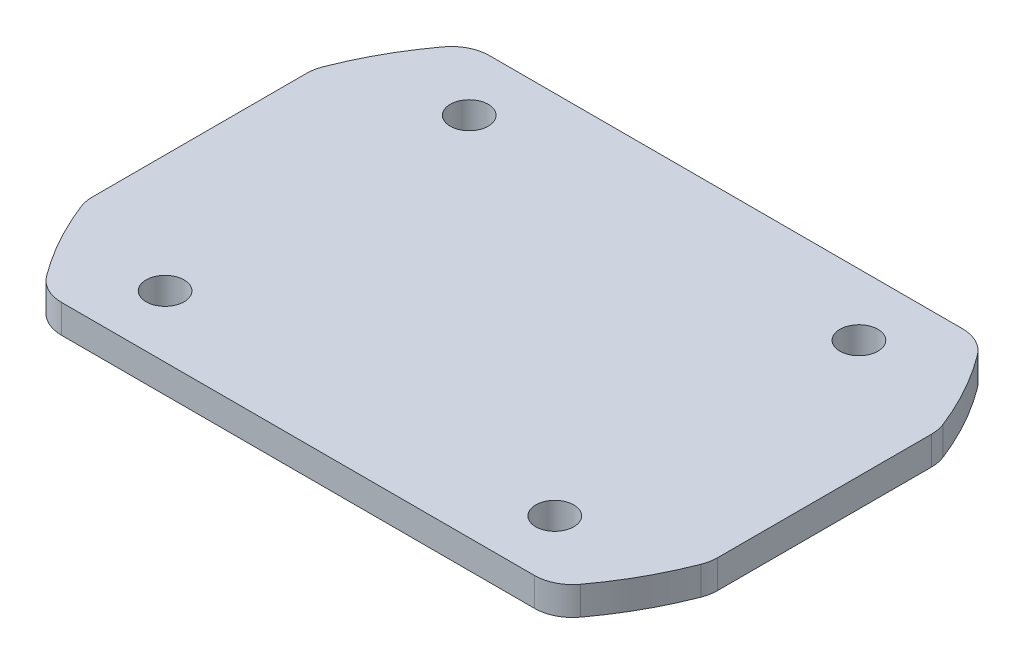
ISO-10303-21;
HEADER;
FILE_DESCRIPTION(('STEP AP214'),'2;1');
FILE_NAME('part.step','',(''),(''),'','','');
FILE_SCHEMA(('AUTOMOTIVE_DESIGN { 1 0 10303 214 1 1 1 1 }'));
ENDSEC;
DATA;
#1=APPLICATION_CONTEXT('core data for automotive mechanical design processes');
#2=APPLICATION_PROTOCOL_DEFINITION('international standard','automotive_design',2000,#1);
#3=PRODUCT_CONTEXT('',#1,'mechanical');
#4=PRODUCT('Part','Part','',(#3));
#5=PRODUCT_RELATED_PRODUCT_CATEGORY('part','',(#4));
#6=PRODUCT_DEFINITION_FORMATION('','',#4);
#7=PRODUCT_DEFINITION_CONTEXT('part definition',#1,'design');
#8=PRODUCT_DEFINITION('design','',#6,#7);
#9=PRODUCT_DEFINITION_SHAPE('','',#8);
#10=(LENGTH_UNIT() NAMED_UNIT(*) SI_UNIT(.MILLI.,.METRE.));
#11=(NAMED_UNIT(*) PLANE_ANGLE_UNIT() SI_UNIT($,.RADIAN.));
#12=(NAMED_UNIT(*) SI_UNIT($,.STERADIAN.) SOLID_ANGLE_UNIT());
#13=UNCERTAINTY_MEASURE_WITH_UNIT(LENGTH_MEASURE(1.E-05),#10,'distance_accuracy_value','');
#14=(GEOMETRIC_REPRESENTATION_CONTEXT(3) GLOBAL_UNCERTAINTY_ASSIGNED_CONTEXT((#13)) GLOBAL_UNIT_ASSIGNED_CONTEXT((#10,
#11,#12)) REPRESENTATION_CONTEXT('',''));
#15=CARTESIAN_POINT('',(0.,0.,0.));
#16=DIRECTION('',(0.,0.,1.));
#17=DIRECTION('',(1.,0.,0.));
#18=AXIS2_PLACEMENT_3D('',#15,#16,#17);
#19=CARTESIAN_POINT('',(0.,1.5,0.));
#20=DIRECTION('',(0.,1.,0.));
#21=DIRECTION('',(0.,0.,1.));
#22=AXIS2_PLACEMENT_3D('',#19,#20,#21);
#23=PLANE('',#22);
#24=CARTESIAN_POINT('',(-10.25,1.5,-8.));
#25=DIRECTION('',(0.,1.,0.));
#26=DIRECTION('',(0.,0.,1.));
#27=AXIS2_PLACEMENT_3D('',#24,#25,#26);
#28=CIRCLE('',#27,0.999999999999999);
#29=CARTESIAN_POINT('',(-10.25,1.5,-7.));
#30=VERTEX_POINT('',#29);
#31=EDGE_CURVE('E420',#30,#30,#28,.T.);
#32=ORIENTED_EDGE('',*,*,#31,.F.);
#33=EDGE_LOOP('',(#32));
#34=FACE_BOUND('',#33,.T.);
#35=CARTESIAN_POINT('',(-10.25,1.5,8.));
#36=DIRECTION('',(0.,1.,0.));
#37=DIRECTION('',(0.,0.,-1.));
#38=AXIS2_PLACEMENT_3D('',#35,#36,#37);
#39=CIRCLE('',#38,1.);
#40=CARTESIAN_POINT('',(-10.25,1.5,7.));
#41=VERTEX_POINT('',#40);
#42=EDGE_CURVE('E183',#41,#41,#39,.T.);
#43=ORIENTED_EDGE('',*,*,#42,.F.);
#44=EDGE_LOOP('',(#43));
#45=FACE_BOUND('',#44,.T.);
#46=DIRECTION('',(-1.,0.,0.));
#47=VECTOR('',#46,1.);
#48=CARTESIAN_POINT('',(-13.4047566184545,1.5,-11.25));
#49=LINE('',#48,#47);
#50=CARTESIAN_POINT('',(12.4373429638327,1.5,-11.25));
#51=VERTEX_POINT('',#50);
#52=CARTESIAN_POINT('',(-12.4373429638327,1.5,-11.25));
#53=VERTEX_POINT('',#52);
#54=EDGE_CURVE('E192',#51,#53,#49,.T.);
#55=ORIENTED_EDGE('',*,*,#54,.T.);
#56=CARTESIAN_POINT('',(-12.4373429638327,1.5,-9.25));
#57=DIRECTION('',(0.,1.,0.));
#58=DIRECTION('',(0.,0.,1.));
#59=AXIS2_PLACEMENT_3D('',#56,#57,#58);
#60=CIRCLE('',#59,2.);
#61=CARTESIAN_POINT('',(-14.0421614107789,1.5,-10.4435483870968));
#62=VERTEX_POINT('',#61);
#63=EDGE_CURVE('E239',#53,#62,#60,.T.);
#64=ORIENTED_EDGE('',*,*,#63,.T.);
#65=CARTESIAN_POINT('',(0.,1.5,0.));
#66=DIRECTION('',(0.,1.,0.));
#67=DIRECTION('',(0.,0.,1.));
#68=AXIS2_PLACEMENT_3D('',#65,#66,#67);
#69=CIRCLE('',#68,17.5);
#70=CARTESIAN_POINT('',(-16.3024154128089,1.5,-6.36248785525056));
#71=VERTEX_POINT('',#70);
#72=EDGE_CURVE('E175',#62,#71,#69,.T.);
#73=ORIENTED_EDGE('',*,*,#72,.T.);
#74=CARTESIAN_POINT('',(-14.4392822227736,1.5,-5.63534638607907));
#75=DIRECTION('',(0.,1.,0.));
#76=DIRECTION('',(0.,0.,1.));
#77=AXIS2_PLACEMENT_3D('',#74,#75,#76);
#78=CIRCLE('',#77,2.);
#79=CARTESIAN_POINT('',(-16.4392822227736,1.5,-5.63534638607907));
#80=VERTEX_POINT('',#79);
#81=EDGE_CURVE('E226',#71,#80,#78,.T.);
#82=ORIENTED_EDGE('',*,*,#81,.T.);
#83=DIRECTION('',(0.,0.,1.));
#84=VECTOR('',#83,1.);
#85=CARTESIAN_POINT('',(-16.4392822227736,1.5,-6.));
#86=LINE('',#85,#84);
#87=CARTESIAN_POINT('',(-16.4392822227736,1.5,5.63534638607907));
#88=VERTEX_POINT('',#87);
#89=EDGE_CURVE('E271',#80,#88,#86,.T.);
#90=ORIENTED_EDGE('',*,*,#89,.T.);
#91=CARTESIAN_POINT('',(-14.4392822227736,1.5,5.63534638607907));
#92=DIRECTION('',(0.,1.,0.));
#93=DIRECTION('',(0.,0.,1.));
#94=AXIS2_PLACEMENT_3D('',#91,#92,#93);
#95=CIRCLE('',#94,2.);
#96=CARTESIAN_POINT('',(-16.3024154128089,1.5,6.36248785525056));
#97=VERTEX_POINT('',#96);
#98=EDGE_CURVE('E228',#88,#97,#95,.T.);
#99=ORIENTED_EDGE('',*,*,#98,.T.);
#100=CARTESIAN_POINT('',(0.,1.5,0.));
#101=DIRECTION('',(0.,1.,0.));
#102=DIRECTION('',(0.,0.,1.));
#103=AXIS2_PLACEMENT_3D('',#100,#101,#102);
#104=CIRCLE('',#103,17.5);
#105=CARTESIAN_POINT('',(-14.0421614107789,1.5,10.4435483870968));
#106=VERTEX_POINT('',#105);
#107=EDGE_CURVE('E284',#97,#106,#104,.T.);
#108=ORIENTED_EDGE('',*,*,#107,.T.);
#109=CARTESIAN_POINT('',(-12.4373429638327,1.5,9.25));
#110=DIRECTION('',(0.,1.,0.));
#111=DIRECTION('',(0.,0.,1.));
#112=AXIS2_PLACEMENT_3D('',#109,#110,#111);
#113=CIRCLE('',#112,2.);
#114=CARTESIAN_POINT('',(-12.4373429638327,1.5,11.25));
#115=VERTEX_POINT('',#114);
#116=EDGE_CURVE('E230',#106,#115,#113,.T.);
#117=ORIENTED_EDGE('',*,*,#116,.T.);
#118=DIRECTION('',(1.,0.,0.));
#119=VECTOR('',#118,1.);
#120=CARTESIAN_POINT('',(-13.4047566184545,1.5,11.25));
#121=LINE('',#120,#119);
#122=CARTESIAN_POINT('',(12.4373429638327,1.5,11.25));
#123=VERTEX_POINT('',#122);
#124=EDGE_CURVE('E286',#115,#123,#121,.T.);
#125=ORIENTED_EDGE('',*,*,#124,.T.);
#126=CARTESIAN_POINT('',(12.4373429638327,1.5,9.25));
#127=DIRECTION('',(0.,1.,0.));
#128=DIRECTION('',(0.,0.,1.));
#129=AXIS2_PLACEMENT_3D('',#126,#127,#128);
#130=CIRCLE('',#129,2.);
#131=CARTESIAN_POINT('',(14.0421614107789,1.5,10.4435483870968));
#132=VERTEX_POINT('',#131);
#133=EDGE_CURVE('E232',#123,#132,#130,.T.);
#134=ORIENTED_EDGE('',*,*,#133,.T.);
#135=CARTESIAN_POINT('',(0.,1.5,0.));
#136=DIRECTION('',(0.,1.,0.));
#137=DIRECTION('',(0.,0.,1.));
#138=AXIS2_PLACEMENT_3D('',#135,#136,#137);
#139=CIRCLE('',#138,17.5);
#140=CARTESIAN_POINT('',(16.3024154128089,1.5,6.36248785525056));
#141=VERTEX_POINT('',#140);
#142=EDGE_CURVE('E289',#132,#141,#139,.T.);
#143=ORIENTED_EDGE('',*,*,#142,.T.);
#144=CARTESIAN_POINT('',(14.4392822227736,1.5,5.63534638607907));
#145=DIRECTION('',(0.,1.,0.));
#146=DIRECTION('',(0.,0.,1.));
#147=AXIS2_PLACEMENT_3D('',#144,#145,#146);
#148=CIRCLE('',#147,2.);
#149=CARTESIAN_POINT('',(16.4392822227736,1.5,5.63534638607907));
#150=VERTEX_POINT('',#149);
#151=EDGE_CURVE('E234',#141,#150,#148,.T.);
#152=ORIENTED_EDGE('',*,*,#151,.T.);
#153=DIRECTION('',(0.,0.,-1.));
#154=VECTOR('',#153,1.);
#155=CARTESIAN_POINT('',(16.4392822227736,1.5,-6.));
#156=LINE('',#155,#154);
#157=CARTESIAN_POINT('',(16.4392822227736,1.5,-5.63534638607907));
#158=VERTEX_POINT('',#157);
#159=EDGE_CURVE('E296',#150,#158,#156,.T.);
#160=ORIENTED_EDGE('',*,*,#159,.T.);
#161=CARTESIAN_POINT('',(14.4392822227736,1.5,-5.63534638607907));
#162=DIRECTION('',(0.,1.,0.));
#163=DIRECTION('',(0.,0.,1.));
#164=AXIS2_PLACEMENT_3D('',#161,#162,#163);
#165=CIRCLE('',#164,2.);
#166=CARTESIAN_POINT('',(16.3024154128089,1.5,-6.36248785525056));
#167=VERTEX_POINT('',#166);
#168=EDGE_CURVE('E63',#158,#167,#165,.T.);
#169=ORIENTED_EDGE('',*,*,#168,.T.);
#170=CARTESIAN_POINT('',(0.,1.5,0.));
#171=DIRECTION('',(0.,1.,0.));
#172=DIRECTION('',(0.,0.,1.));
#173=AXIS2_PLACEMENT_3D('',#170,#171,#172);
#174=CIRCLE('',#173,17.5);
#175=CARTESIAN_POINT('',(14.0421614107789,1.5,-10.4435483870968));
#176=VERTEX_POINT('',#175);
#177=EDGE_CURVE('E297',#167,#176,#174,.T.);
#178=ORIENTED_EDGE('',*,*,#177,.T.);
#179=CARTESIAN_POINT('',(12.4373429638327,1.5,-9.25));
#180=DIRECTION('',(0.,1.,0.));
#181=DIRECTION('',(0.,0.,1.));
#182=AXIS2_PLACEMENT_3D('',#179,#180,#181);
#183=CIRCLE('',#182,2.);
#184=EDGE_CURVE('E237',#176,#51,#183,.T.);
#185=ORIENTED_EDGE('',*,*,#184,.T.);
#186=EDGE_LOOP('',(#55,#64,#73,#82,#90,#99,#108,#117,#125,#134,#143,#152,#160,#169,#178,#185));
#187=FACE_BOUND('',#186,.T.);
#188=CARTESIAN_POINT('',(10.25,1.5,8.));
#189=DIRECTION('',(0.,1.,0.));
#190=DIRECTION('',(0.,0.,1.));
#191=AXIS2_PLACEMENT_3D('',#188,#189,#190);
#192=CIRCLE('',#191,1.);
#193=CARTESIAN_POINT('',(10.25,1.5,9.));
#194=VERTEX_POINT('',#193);
#195=EDGE_CURVE('E415',#194,#194,#192,.T.);
#196=ORIENTED_EDGE('',*,*,#195,.F.);
#197=EDGE_LOOP('',(#196));
#198=FACE_BOUND('',#197,.T.);
#199=CARTESIAN_POINT('',(10.25,1.5,-8.));
#200=DIRECTION('',(0.,1.,0.));
#201=DIRECTION('',(0.,0.,-1.));
#202=AXIS2_PLACEMENT_3D('',#199,#200,#201);
#203=CIRCLE('',#202,0.999999999999999);
#204=CARTESIAN_POINT('',(10.25,1.5,-9.));
#205=VERTEX_POINT('',#204);
#206=EDGE_CURVE('E426',#205,#205,#203,.T.);
#207=ORIENTED_EDGE('',*,*,#206,.F.);
#208=EDGE_LOOP('',(#207));
#209=FACE_BOUND('',#208,.T.);
#210=ADVANCED_FACE('F41',(#34,#45,#187,#198,#209),#23,.T.);
#211=CARTESIAN_POINT('',(0.,0.,0.));
#212=DIRECTION('',(0.,1.,0.));
#213=DIRECTION('',(0.,0.,1.));
#214=AXIS2_PLACEMENT_3D('',#211,#212,#213);
#215=PLANE('',#214);
#216=CARTESIAN_POINT('',(0.,0.,0.));
#217=DIRECTION('',(0.,1.,0.));
#218=DIRECTION('',(0.,0.,1.));
#219=AXIS2_PLACEMENT_3D('',#216,#217,#218);
#220=CIRCLE('',#219,17.5);
#221=CARTESIAN_POINT('',(-14.0421614107789,0.,-10.4435483870968));
#222=VERTEX_POINT('',#221);
#223=CARTESIAN_POINT('',(-16.3024154128089,0.,-6.36248785525056));
#224=VERTEX_POINT('',#223);
#225=EDGE_CURVE('E172',#222,#224,#220,.T.);
#226=ORIENTED_EDGE('',*,*,#225,.F.);
#227=CARTESIAN_POINT('',(-12.4373429638327,0.,-9.25));
#228=DIRECTION('',(0.,1.,0.));
#229=DIRECTION('',(0.,0.,1.));
#230=AXIS2_PLACEMENT_3D('',#227,#228,#229);
#231=CIRCLE('',#230,2.);
#232=CARTESIAN_POINT('',(-12.4373429638327,0.,-11.25));
#233=VERTEX_POINT('',#232);
#234=EDGE_CURVE('E155',#222,#233,#231,.F.);
#235=ORIENTED_EDGE('',*,*,#234,.T.);
#236=DIRECTION('',(-1.,0.,0.));
#237=VECTOR('',#236,1.);
#238=CARTESIAN_POINT('',(-13.4047566184545,0.,-11.25));
#239=LINE('',#238,#237);
#240=CARTESIAN_POINT('',(12.4373429638327,0.,-11.25));
#241=VERTEX_POINT('',#240);
#242=EDGE_CURVE('E208',#241,#233,#239,.T.);
#243=ORIENTED_EDGE('',*,*,#242,.F.);
#244=CARTESIAN_POINT('',(12.4373429638327,0.,-9.25));
#245=DIRECTION('',(0.,1.,0.));
#246=DIRECTION('',(0.,0.,1.));
#247=AXIS2_PLACEMENT_3D('',#244,#245,#246);
#248=CIRCLE('',#247,2.);
#249=CARTESIAN_POINT('',(14.0421614107789,0.,-10.4435483870968));
#250=VERTEX_POINT('',#249);
#251=EDGE_CURVE('E166',#241,#250,#248,.F.);
#252=ORIENTED_EDGE('',*,*,#251,.T.);
#253=CARTESIAN_POINT('',(0.,0.,0.));
#254=DIRECTION('',(0.,1.,0.));
#255=DIRECTION('',(0.,0.,1.));
#256=AXIS2_PLACEMENT_3D('',#253,#254,#255);
#257=CIRCLE('',#256,17.5);
#258=CARTESIAN_POINT('',(16.3024154128089,0.,-6.36248785525056));
#259=VERTEX_POINT('',#258);
#260=EDGE_CURVE('E206',#259,#250,#257,.T.);
#261=ORIENTED_EDGE('',*,*,#260,.F.);
#262=CARTESIAN_POINT('',(14.4392822227736,0.,-5.63534638607907));
#263=DIRECTION('',(0.,1.,0.));
#264=DIRECTION('',(0.,0.,1.));
#265=AXIS2_PLACEMENT_3D('',#262,#263,#264);
#266=CIRCLE('',#265,2.);
#267=CARTESIAN_POINT('',(16.4392822227736,0.,-5.63534638607907));
#268=VERTEX_POINT('',#267);
#269=EDGE_CURVE('E220',#259,#268,#266,.F.);
#270=ORIENTED_EDGE('',*,*,#269,.T.);
#271=DIRECTION('',(0.,0.,-1.));
#272=VECTOR('',#271,1.);
#273=CARTESIAN_POINT('',(16.4392822227736,0.,-6.));
#274=LINE('',#273,#272);
#275=CARTESIAN_POINT('',(16.4392822227736,0.,5.63534638607907));
#276=VERTEX_POINT('',#275);
#277=EDGE_CURVE('E203',#276,#268,#274,.T.);
#278=ORIENTED_EDGE('',*,*,#277,.F.);
#279=CARTESIAN_POINT('',(14.4392822227736,0.,5.63534638607907));
#280=DIRECTION('',(0.,1.,0.));
#281=DIRECTION('',(0.,0.,1.));
#282=AXIS2_PLACEMENT_3D('',#279,#280,#281);
#283=CIRCLE('',#282,2.);
#284=CARTESIAN_POINT('',(16.3024154128089,0.,6.36248785525056));
#285=VERTEX_POINT('',#284);
#286=EDGE_CURVE('E218',#276,#285,#283,.F.);
#287=ORIENTED_EDGE('',*,*,#286,.T.);
#288=CARTESIAN_POINT('',(0.,0.,0.));
#289=DIRECTION('',(0.,1.,0.));
#290=DIRECTION('',(0.,0.,1.));
#291=AXIS2_PLACEMENT_3D('',#288,#289,#290);
#292=CIRCLE('',#291,17.5);
#293=CARTESIAN_POINT('',(14.0421614107789,0.,10.4435483870968));
#294=VERTEX_POINT('',#293);
#295=EDGE_CURVE('E200',#294,#285,#292,.T.);
#296=ORIENTED_EDGE('',*,*,#295,.F.);
#297=CARTESIAN_POINT('',(12.4373429638327,0.,9.25));
#298=DIRECTION('',(0.,1.,0.));
#299=DIRECTION('',(0.,0.,1.));
#300=AXIS2_PLACEMENT_3D('',#297,#298,#299);
#301=CIRCLE('',#300,2.);
#302=CARTESIAN_POINT('',(12.4373429638327,0.,11.25));
#303=VERTEX_POINT('',#302);
#304=EDGE_CURVE('E216',#294,#303,#301,.F.);
#305=ORIENTED_EDGE('',*,*,#304,.T.);
#306=DIRECTION('',(1.,0.,0.));
#307=VECTOR('',#306,1.);
#308=CARTESIAN_POINT('',(-13.4047566184545,0.,11.25));
#309=LINE('',#308,#307);
#310=CARTESIAN_POINT('',(-12.4373429638327,0.,11.25));
#311=VERTEX_POINT('',#310);
#312=EDGE_CURVE('E197',#311,#303,#309,.T.);
#313=ORIENTED_EDGE('',*,*,#312,.F.);
#314=CARTESIAN_POINT('',(-12.4373429638327,0.,9.25));
#315=DIRECTION('',(0.,1.,0.));
#316=DIRECTION('',(0.,0.,1.));
#317=AXIS2_PLACEMENT_3D('',#314,#315,#316);
#318=CIRCLE('',#317,2.);
#319=CARTESIAN_POINT('',(-14.0421614107789,0.,10.4435483870968));
#320=VERTEX_POINT('',#319);
#321=EDGE_CURVE('E214',#311,#320,#318,.F.);
#322=ORIENTED_EDGE('',*,*,#321,.T.);
#323=CARTESIAN_POINT('',(0.,0.,0.));
#324=DIRECTION('',(0.,1.,0.));
#325=DIRECTION('',(0.,0.,1.));
#326=AXIS2_PLACEMENT_3D('',#323,#324,#325);
#327=CIRCLE('',#326,17.5);
#328=CARTESIAN_POINT('',(-16.3024154128089,0.,6.36248785525056));
#329=VERTEX_POINT('',#328);
#330=EDGE_CURVE('E186',#329,#320,#327,.T.);
#331=ORIENTED_EDGE('',*,*,#330,.F.);
#332=CARTESIAN_POINT('',(-14.4392822227736,0.,5.63534638607907));
#333=DIRECTION('',(0.,1.,0.));
#334=DIRECTION('',(0.,0.,1.));
#335=AXIS2_PLACEMENT_3D('',#332,#333,#334);
#336=CIRCLE('',#335,2.);
#337=CARTESIAN_POINT('',(-16.4392822227736,0.,5.63534638607907));
#338=VERTEX_POINT('',#337);
#339=EDGE_CURVE('E212',#329,#338,#336,.F.);
#340=ORIENTED_EDGE('',*,*,#339,.T.);
#341=DIRECTION('',(0.,0.,1.));
#342=VECTOR('',#341,1.);
#343=CARTESIAN_POINT('',(-16.4392822227736,0.,-6.));
#344=LINE('',#343,#342);
#345=CARTESIAN_POINT('',(-16.4392822227736,0.,-5.63534638607907));
#346=VERTEX_POINT('',#345);
#347=EDGE_CURVE('E182',#346,#338,#344,.T.);
#348=ORIENTED_EDGE('',*,*,#347,.F.);
#349=CARTESIAN_POINT('',(-14.4392822227736,0.,-5.63534638607907));
#350=DIRECTION('',(0.,1.,0.));
#351=DIRECTION('',(0.,0.,1.));
#352=AXIS2_PLACEMENT_3D('',#349,#350,#351);
#353=CIRCLE('',#352,2.);
#354=EDGE_CURVE('E176',#346,#224,#353,.F.);
#355=ORIENTED_EDGE('',*,*,#354,.T.);
#356=EDGE_LOOP('',(#226,#235,#243,#252,#261,#270,#278,#287,#296,#305,#313,#322,#331,#340,#348,#355));
#357=FACE_BOUND('',#356,.T.);
#358=CARTESIAN_POINT('',(-10.25,0.,8.));
#359=DIRECTION('',(0.,1.,0.));
#360=DIRECTION('',(0.,0.,-1.));
#361=AXIS2_PLACEMENT_3D('',#358,#359,#360);
#362=CIRCLE('',#361,1.);
#363=CARTESIAN_POINT('',(-10.25,0.,7.));
#364=VERTEX_POINT('',#363);
#365=EDGE_CURVE('E189',#364,#364,#362,.T.);
#366=ORIENTED_EDGE('',*,*,#365,.T.);
#367=EDGE_LOOP('',(#366));
#368=FACE_BOUND('',#367,.T.);
#369=CARTESIAN_POINT('',(10.25,0.,8.));
#370=DIRECTION('',(0.,1.,0.));
#371=DIRECTION('',(0.,0.,1.));
#372=AXIS2_PLACEMENT_3D('',#369,#370,#371);
#373=CIRCLE('',#372,1.);
#374=CARTESIAN_POINT('',(10.25,0.,9.));
#375=VERTEX_POINT('',#374);
#376=EDGE_CURVE('E417',#375,#375,#373,.T.);
#377=ORIENTED_EDGE('',*,*,#376,.T.);
#378=EDGE_LOOP('',(#377));
#379=FACE_BOUND('',#378,.T.);
#380=CARTESIAN_POINT('',(-10.25,0.,-8.));
#381=DIRECTION('',(0.,1.,0.));
#382=DIRECTION('',(0.,0.,1.));
#383=AXIS2_PLACEMENT_3D('',#380,#381,#382);
#384=CIRCLE('',#383,0.999999999999999);
#385=CARTESIAN_POINT('',(-10.25,0.,-7.));
#386=VERTEX_POINT('',#385);
#387=EDGE_CURVE('E423',#386,#386,#384,.T.);
#388=ORIENTED_EDGE('',*,*,#387,.T.);
#389=EDGE_LOOP('',(#388));
#390=FACE_BOUND('',#389,.T.);
#391=CARTESIAN_POINT('',(10.25,0.,-8.));
#392=DIRECTION('',(0.,1.,0.));
#393=DIRECTION('',(0.,0.,-1.));
#394=AXIS2_PLACEMENT_3D('',#391,#392,#393);
#395=CIRCLE('',#394,0.999999999999999);
#396=CARTESIAN_POINT('',(10.25,0.,-9.));
#397=VERTEX_POINT('',#396);
#398=EDGE_CURVE('E429',#397,#397,#395,.T.);
#399=ORIENTED_EDGE('',*,*,#398,.T.);
#400=EDGE_LOOP('',(#399));
#401=FACE_BOUND('',#400,.T.);
#402=ADVANCED_FACE('F179',(#357,#368,#379,#390,#401),#215,.F.);
#403=CARTESIAN_POINT('',(0.,1.5,0.));
#404=DIRECTION('',(0.,-1.,0.));
#405=DIRECTION('',(0.,0.,-1.));
#406=AXIS2_PLACEMENT_3D('',#403,#404,#405);
#407=CYLINDRICAL_SURFACE('',#406,17.5);
#408=ORIENTED_EDGE('',*,*,#72,.F.);
#409=DIRECTION('',(0.,-1.,0.));
#410=VECTOR('',#409,1.);
#411=CARTESIAN_POINT('',(-14.0421614107789,1.5,-10.4435483870968));
#412=LINE('',#411,#410);
#413=EDGE_CURVE('E159',#62,#222,#412,.T.);
#414=ORIENTED_EDGE('',*,*,#413,.T.);
#415=ORIENTED_EDGE('',*,*,#225,.T.);
#416=DIRECTION('',(0.,-1.,0.));
#417=VECTOR('',#416,1.);
#418=CARTESIAN_POINT('',(-16.3024154128089,1.5,-6.36248785525056));
#419=LINE('',#418,#417);
#420=EDGE_CURVE('E177',#224,#71,#419,.F.);
#421=ORIENTED_EDGE('',*,*,#420,.T.);
#422=EDGE_LOOP('',(#408,#414,#415,#421));
#423=FACE_BOUND('',#422,.T.);
#424=ADVANCED_FACE('F171',(#423),#407,.T.);
#425=CARTESIAN_POINT('',(-16.4392822227736,1.5,-6.));
#426=DIRECTION('',(1.,0.,0.));
#427=DIRECTION('',(0.,0.,-1.));
#428=AXIS2_PLACEMENT_3D('',#425,#426,#427);
#429=PLANE('',#428);
#430=ORIENTED_EDGE('',*,*,#347,.T.);
#431=DIRECTION('',(0.,-1.,0.));
#432=VECTOR('',#431,1.);
#433=CARTESIAN_POINT('',(-16.4392822227736,1.5,5.63534638607907));
#434=LINE('',#433,#432);
#435=EDGE_CURVE('E11',#338,#88,#434,.F.);
#436=ORIENTED_EDGE('',*,*,#435,.T.);
#437=ORIENTED_EDGE('',*,*,#89,.F.);
#438=DIRECTION('',(0.,-1.,0.));
#439=VECTOR('',#438,1.);
#440=CARTESIAN_POINT('',(-16.4392822227736,1.5,-5.63534638607907));
#441=LINE('',#440,#439);
#442=EDGE_CURVE('E49',#80,#346,#441,.T.);
#443=ORIENTED_EDGE('',*,*,#442,.T.);
#444=EDGE_LOOP('',(#430,#436,#437,#443));
#445=FACE_BOUND('',#444,.T.);
#446=ADVANCED_FACE('F268',(#445),#429,.F.);
#447=CARTESIAN_POINT('',(0.,1.5,0.));
#448=DIRECTION('',(0.,-1.,0.));
#449=DIRECTION('',(0.,0.,-1.));
#450=AXIS2_PLACEMENT_3D('',#447,#448,#449);
#451=CYLINDRICAL_SURFACE('',#450,17.5);
#452=ORIENTED_EDGE('',*,*,#330,.T.);
#453=DIRECTION('',(0.,-1.,0.));
#454=VECTOR('',#453,1.);
#455=CARTESIAN_POINT('',(-14.0421614107789,1.5,10.4435483870968));
#456=LINE('',#455,#454);
#457=EDGE_CURVE('E263',#320,#106,#456,.F.);
#458=ORIENTED_EDGE('',*,*,#457,.T.);
#459=ORIENTED_EDGE('',*,*,#107,.F.);
#460=DIRECTION('',(0.,-1.,0.));
#461=VECTOR('',#460,1.);
#462=CARTESIAN_POINT('',(-16.3024154128089,1.5,6.36248785525056));
#463=LINE('',#462,#461);
#464=EDGE_CURVE('E260',#97,#329,#463,.T.);
#465=ORIENTED_EDGE('',*,*,#464,.T.);
#466=EDGE_LOOP('',(#452,#458,#459,#465));
#467=FACE_BOUND('',#466,.T.);
#468=ADVANCED_FACE('F281',(#467),#451,.T.);
#469=CARTESIAN_POINT('',(-13.4047566184545,1.5,11.25));
#470=DIRECTION('',(0.,0.,-1.));
#471=DIRECTION('',(-1.,0.,0.));
#472=AXIS2_PLACEMENT_3D('',#469,#470,#471);
#473=PLANE('',#472);
#474=ORIENTED_EDGE('',*,*,#312,.T.);
#475=DIRECTION('',(0.,-1.,0.));
#476=VECTOR('',#475,1.);
#477=CARTESIAN_POINT('',(12.4373429638327,1.5,11.25));
#478=LINE('',#477,#476);
#479=EDGE_CURVE('E258',#303,#123,#478,.F.);
#480=ORIENTED_EDGE('',*,*,#479,.T.);
#481=ORIENTED_EDGE('',*,*,#124,.F.);
#482=DIRECTION('',(0.,-1.,0.));
#483=VECTOR('',#482,1.);
#484=CARTESIAN_POINT('',(-12.4373429638327,1.5,11.25));
#485=LINE('',#484,#483);
#486=EDGE_CURVE('E255',#115,#311,#485,.T.);
#487=ORIENTED_EDGE('',*,*,#486,.T.);
#488=EDGE_LOOP('',(#474,#480,#481,#487));
#489=FACE_BOUND('',#488,.T.);
#490=ADVANCED_FACE('F333',(#489),#473,.F.);
#491=CARTESIAN_POINT('',(0.,1.5,0.));
#492=DIRECTION('',(0.,-1.,0.));
#493=DIRECTION('',(0.,0.,-1.));
#494=AXIS2_PLACEMENT_3D('',#491,#492,#493);
#495=CYLINDRICAL_SURFACE('',#494,17.5);
#496=ORIENTED_EDGE('',*,*,#295,.T.);
#497=DIRECTION('',(0.,-1.,0.));
#498=VECTOR('',#497,1.);
#499=CARTESIAN_POINT('',(16.3024154128089,1.5,6.36248785525056));
#500=LINE('',#499,#498);
#501=EDGE_CURVE('E253',#285,#141,#500,.F.);
#502=ORIENTED_EDGE('',*,*,#501,.T.);
#503=ORIENTED_EDGE('',*,*,#142,.F.);
#504=DIRECTION('',(0.,-1.,0.));
#505=VECTOR('',#504,1.);
#506=CARTESIAN_POINT('',(14.0421614107789,1.5,10.4435483870968));
#507=LINE('',#506,#505);
#508=EDGE_CURVE('E250',#132,#294,#507,.T.);
#509=ORIENTED_EDGE('',*,*,#508,.T.);
#510=EDGE_LOOP('',(#496,#502,#503,#509));
#511=FACE_BOUND('',#510,.T.);
#512=ADVANCED_FACE('F324',(#511),#495,.T.);
#513=CARTESIAN_POINT('',(16.4392822227736,1.5,-6.));
#514=DIRECTION('',(-1.,0.,0.));
#515=DIRECTION('',(0.,0.,1.));
#516=AXIS2_PLACEMENT_3D('',#513,#514,#515);
#517=PLANE('',#516);
#518=ORIENTED_EDGE('',*,*,#277,.T.);
#519=DIRECTION('',(0.,-1.,0.));
#520=VECTOR('',#519,1.);
#521=CARTESIAN_POINT('',(16.4392822227736,1.5,-5.63534638607907));
#522=LINE('',#521,#520);
#523=EDGE_CURVE('E248',#268,#158,#522,.F.);
#524=ORIENTED_EDGE('',*,*,#523,.T.);
#525=ORIENTED_EDGE('',*,*,#159,.F.);
#526=DIRECTION('',(0.,-1.,0.));
#527=VECTOR('',#526,1.);
#528=CARTESIAN_POINT('',(16.4392822227736,1.5,5.63534638607907));
#529=LINE('',#528,#527);
#530=EDGE_CURVE('E245',#150,#276,#529,.T.);
#531=ORIENTED_EDGE('',*,*,#530,.T.);
#532=EDGE_LOOP('',(#518,#524,#525,#531));
#533=FACE_BOUND('',#532,.T.);
#534=ADVANCED_FACE('F315',(#533),#517,.F.);
#535=CARTESIAN_POINT('',(0.,1.5,0.));
#536=DIRECTION('',(0.,-1.,0.));
#537=DIRECTION('',(0.,0.,-1.));
#538=AXIS2_PLACEMENT_3D('',#535,#536,#537);
#539=CYLINDRICAL_SURFACE('',#538,17.5);
#540=ORIENTED_EDGE('',*,*,#260,.T.);
#541=DIRECTION('',(0.,-1.,0.));
#542=VECTOR('',#541,1.);
#543=CARTESIAN_POINT('',(14.0421614107789,1.5,-10.4435483870968));
#544=LINE('',#543,#542);
#545=EDGE_CURVE('E56',#250,#176,#544,.F.);
#546=ORIENTED_EDGE('',*,*,#545,.T.);
#547=ORIENTED_EDGE('',*,*,#177,.F.);
#548=DIRECTION('',(0.,-1.,0.));
#549=VECTOR('',#548,1.);
#550=CARTESIAN_POINT('',(16.3024154128089,1.5,-6.36248785525056));
#551=LINE('',#550,#549);
#552=EDGE_CURVE('E241',#167,#259,#551,.T.);
#553=ORIENTED_EDGE('',*,*,#552,.T.);
#554=EDGE_LOOP('',(#540,#546,#547,#553));
#555=FACE_BOUND('',#554,.T.);
#556=ADVANCED_FACE('F308',(#555),#539,.T.);
#557=CARTESIAN_POINT('',(-13.4047566184545,1.5,-11.25));
#558=DIRECTION('',(0.,0.,1.));
#559=DIRECTION('',(1.,0.,0.));
#560=AXIS2_PLACEMENT_3D('',#557,#558,#559);
#561=PLANE('',#560);
#562=ORIENTED_EDGE('',*,*,#242,.T.);
#563=DIRECTION('',(0.,-1.,0.));
#564=VECTOR('',#563,1.);
#565=CARTESIAN_POINT('',(-12.4373429638327,1.5,-11.25));
#566=LINE('',#565,#564);
#567=EDGE_CURVE('E160',#233,#53,#566,.F.);
#568=ORIENTED_EDGE('',*,*,#567,.T.);
#569=ORIENTED_EDGE('',*,*,#54,.F.);
#570=DIRECTION('',(0.,-1.,0.));
#571=VECTOR('',#570,1.);
#572=CARTESIAN_POINT('',(12.4373429638327,1.5,-11.25));
#573=LINE('',#572,#571);
#574=EDGE_CURVE('E165',#51,#241,#573,.T.);
#575=ORIENTED_EDGE('',*,*,#574,.T.);
#576=EDGE_LOOP('',(#562,#568,#569,#575));
#577=FACE_BOUND('',#576,.T.);
#578=ADVANCED_FACE('F304',(#577),#561,.F.);
#579=CARTESIAN_POINT('',(-10.25,1.5,8.));
#580=DIRECTION('',(0.,-1.,0.));
#581=DIRECTION('',(0.,0.,-1.));
#582=AXIS2_PLACEMENT_3D('',#579,#580,#581);
#583=CYLINDRICAL_SURFACE('',#582,1.);
#584=ORIENTED_EDGE('',*,*,#42,.T.);
#585=EDGE_LOOP('',(#584));
#586=FACE_BOUND('',#585,.T.);
#587=ORIENTED_EDGE('',*,*,#365,.F.);
#588=EDGE_LOOP('',(#587));
#589=FACE_BOUND('',#588,.T.);
#590=ADVANCED_FACE('F356',(#586,#589),#583,.F.);
#591=CARTESIAN_POINT('',(10.25,1.5,8.));
#592=DIRECTION('',(0.,-1.,0.));
#593=DIRECTION('',(0.,0.,-1.));
#594=AXIS2_PLACEMENT_3D('',#591,#592,#593);
#595=CYLINDRICAL_SURFACE('',#594,1.);
#596=ORIENTED_EDGE('',*,*,#195,.T.);
#597=EDGE_LOOP('',(#596));
#598=FACE_BOUND('',#597,.T.);
#599=ORIENTED_EDGE('',*,*,#376,.F.);
#600=EDGE_LOOP('',(#599));
#601=FACE_BOUND('',#600,.T.);
#602=ADVANCED_FACE('F444',(#598,#601),#595,.F.);
#603=CARTESIAN_POINT('',(-10.25,1.5,-8.));
#604=DIRECTION('',(0.,-1.,0.));
#605=DIRECTION('',(0.,0.,-1.));
#606=AXIS2_PLACEMENT_3D('',#603,#604,#605);
#607=CYLINDRICAL_SURFACE('',#606,0.999999999999999);
#608=ORIENTED_EDGE('',*,*,#31,.T.);
#609=EDGE_LOOP('',(#608));
#610=FACE_BOUND('',#609,.T.);
#611=ORIENTED_EDGE('',*,*,#387,.F.);
#612=EDGE_LOOP('',(#611));
#613=FACE_BOUND('',#612,.T.);
#614=ADVANCED_FACE('F437',(#610,#613),#607,.F.);
#615=CARTESIAN_POINT('',(10.25,1.5,-8.));
#616=DIRECTION('',(0.,-1.,0.));
#617=DIRECTION('',(0.,0.,-1.));
#618=AXIS2_PLACEMENT_3D('',#615,#616,#617);
#619=CYLINDRICAL_SURFACE('',#618,0.999999999999999);
#620=ORIENTED_EDGE('',*,*,#206,.T.);
#621=EDGE_LOOP('',(#620));
#622=FACE_BOUND('',#621,.T.);
#623=ORIENTED_EDGE('',*,*,#398,.F.);
#624=EDGE_LOOP('',(#623));
#625=FACE_BOUND('',#624,.T.);
#626=ADVANCED_FACE('F377',(#622,#625),#619,.F.);
#627=CARTESIAN_POINT('',(-12.4373429638327,1.5,-9.25));
#628=DIRECTION('',(0.,-1.,0.));
#629=DIRECTION('',(0.,0.,-1.));
#630=AXIS2_PLACEMENT_3D('',#627,#628,#629);
#631=CYLINDRICAL_SURFACE('',#630,2.);
#632=ORIENTED_EDGE('',*,*,#63,.F.);
#633=ORIENTED_EDGE('',*,*,#567,.F.);
#634=ORIENTED_EDGE('',*,*,#234,.F.);
#635=ORIENTED_EDGE('',*,*,#413,.F.);
#636=EDGE_LOOP('',(#632,#633,#634,#635));
#637=FACE_BOUND('',#636,.T.);
#638=ADVANCED_FACE('F158',(#637),#631,.T.);
#639=CARTESIAN_POINT('',(12.4373429638327,1.5,-9.25));
#640=DIRECTION('',(0.,-1.,0.));
#641=DIRECTION('',(0.,0.,-1.));
#642=AXIS2_PLACEMENT_3D('',#639,#640,#641);
#643=CYLINDRICAL_SURFACE('',#642,2.);
#644=ORIENTED_EDGE('',*,*,#184,.F.);
#645=ORIENTED_EDGE('',*,*,#545,.F.);
#646=ORIENTED_EDGE('',*,*,#251,.F.);
#647=ORIENTED_EDGE('',*,*,#574,.F.);
#648=EDGE_LOOP('',(#644,#645,#646,#647));
#649=FACE_BOUND('',#648,.T.);
#650=ADVANCED_FACE('F306',(#649),#643,.T.);
#651=CARTESIAN_POINT('',(14.4392822227736,1.5,-5.63534638607907));
#652=DIRECTION('',(0.,-1.,0.));
#653=DIRECTION('',(0.,0.,-1.));
#654=AXIS2_PLACEMENT_3D('',#651,#652,#653);
#655=CYLINDRICAL_SURFACE('',#654,2.);
#656=ORIENTED_EDGE('',*,*,#168,.F.);
#657=ORIENTED_EDGE('',*,*,#523,.F.);
#658=ORIENTED_EDGE('',*,*,#269,.F.);
#659=ORIENTED_EDGE('',*,*,#552,.F.);
#660=EDGE_LOOP('',(#656,#657,#658,#659));
#661=FACE_BOUND('',#660,.T.);
#662=ADVANCED_FACE('F311',(#661),#655,.T.);
#663=CARTESIAN_POINT('',(14.4392822227736,1.5,5.63534638607907));
#664=DIRECTION('',(0.,-1.,0.));
#665=DIRECTION('',(0.,0.,-1.));
#666=AXIS2_PLACEMENT_3D('',#663,#664,#665);
#667=CYLINDRICAL_SURFACE('',#666,2.);
#668=ORIENTED_EDGE('',*,*,#151,.F.);
#669=ORIENTED_EDGE('',*,*,#501,.F.);
#670=ORIENTED_EDGE('',*,*,#286,.F.);
#671=ORIENTED_EDGE('',*,*,#530,.F.);
#672=EDGE_LOOP('',(#668,#669,#670,#671));
#673=FACE_BOUND('',#672,.T.);
#674=ADVANCED_FACE('F320',(#673),#667,.T.);
#675=CARTESIAN_POINT('',(12.4373429638327,1.5,9.25));
#676=DIRECTION('',(0.,-1.,0.));
#677=DIRECTION('',(0.,0.,-1.));
#678=AXIS2_PLACEMENT_3D('',#675,#676,#677);
#679=CYLINDRICAL_SURFACE('',#678,2.);
#680=ORIENTED_EDGE('',*,*,#133,.F.);
#681=ORIENTED_EDGE('',*,*,#479,.F.);
#682=ORIENTED_EDGE('',*,*,#304,.F.);
#683=ORIENTED_EDGE('',*,*,#508,.F.);
#684=EDGE_LOOP('',(#680,#681,#682,#683));
#685=FACE_BOUND('',#684,.T.);
#686=ADVANCED_FACE('F329',(#685),#679,.T.);
#687=CARTESIAN_POINT('',(-12.4373429638327,1.5,9.25));
#688=DIRECTION('',(0.,-1.,0.));
#689=DIRECTION('',(0.,0.,-1.));
#690=AXIS2_PLACEMENT_3D('',#687,#688,#689);
#691=CYLINDRICAL_SURFACE('',#690,2.);
#692=ORIENTED_EDGE('',*,*,#116,.F.);
#693=ORIENTED_EDGE('',*,*,#457,.F.);
#694=ORIENTED_EDGE('',*,*,#321,.F.);
#695=ORIENTED_EDGE('',*,*,#486,.F.);
#696=EDGE_LOOP('',(#692,#693,#694,#695));
#697=FACE_BOUND('',#696,.T.);
#698=ADVANCED_FACE('F337',(#697),#691,.T.);
#699=CARTESIAN_POINT('',(-14.4392822227736,1.5,5.63534638607907));
#700=DIRECTION('',(0.,-1.,0.));
#701=DIRECTION('',(0.,0.,-1.));
#702=AXIS2_PLACEMENT_3D('',#699,#700,#701);
#703=CYLINDRICAL_SURFACE('',#702,2.);
#704=ORIENTED_EDGE('',*,*,#98,.F.);
#705=ORIENTED_EDGE('',*,*,#435,.F.);
#706=ORIENTED_EDGE('',*,*,#339,.F.);
#707=ORIENTED_EDGE('',*,*,#464,.F.);
#708=EDGE_LOOP('',(#704,#705,#706,#707));
#709=FACE_BOUND('',#708,.T.);
#710=ADVANCED_FACE('F278',(#709),#703,.T.);
#711=CARTESIAN_POINT('',(-14.4392822227736,1.5,-5.63534638607907));
#712=DIRECTION('',(0.,-1.,0.));
#713=DIRECTION('',(0.,0.,-1.));
#714=AXIS2_PLACEMENT_3D('',#711,#712,#713);
#715=CYLINDRICAL_SURFACE('',#714,2.);
#716=ORIENTED_EDGE('',*,*,#81,.F.);
#717=ORIENTED_EDGE('',*,*,#420,.F.);
#718=ORIENTED_EDGE('',*,*,#354,.F.);
#719=ORIENTED_EDGE('',*,*,#442,.F.);
#720=EDGE_LOOP('',(#716,#717,#718,#719));
#721=FACE_BOUND('',#720,.T.);
#722=ADVANCED_FACE('F43',(#721),#715,.T.);
#723=CLOSED_SHELL('',(#210,#402,#424,#446,#468,#490,#512,#534,#556,#578,#590,#602,#614,#626,
#638,#650,#662,#674,#686,#698,#710,#722));
#724=MANIFOLD_SOLID_BREP('B2',#723);
#725=ADVANCED_BREP_SHAPE_REPRESENTATION('',(#18,#724),#14);
#726=SHAPE_DEFINITION_REPRESENTATION(#9,#725);
ENDSEC;
END-ISO-10303-21;
